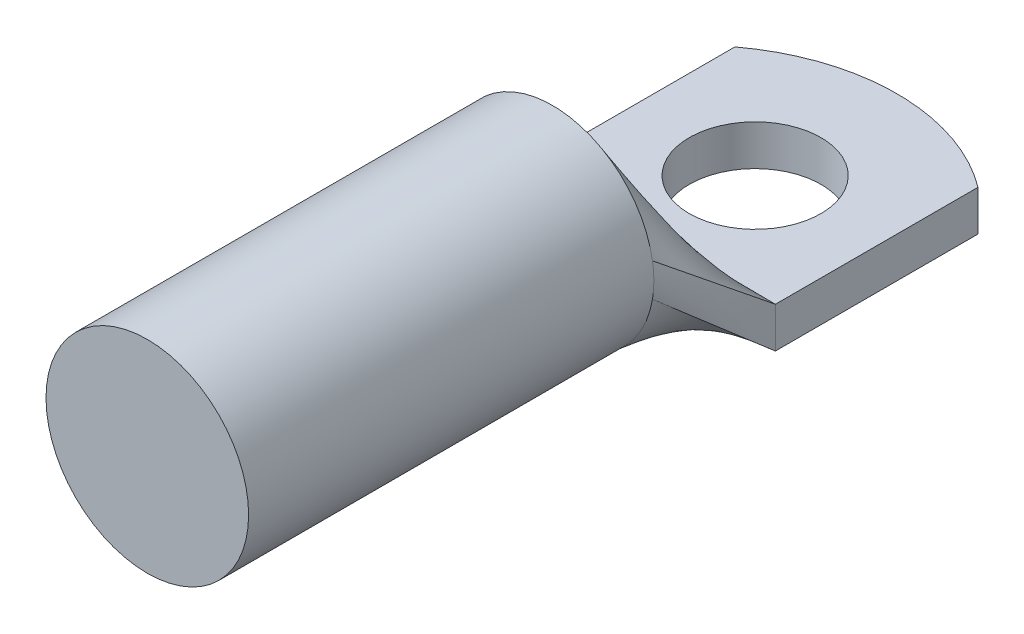
ISO-10303-21;
HEADER;
FILE_DESCRIPTION(('STEP AP214'),'2;1');
FILE_NAME('part.step','',(''),(''),'','','');
FILE_SCHEMA(('AUTOMOTIVE_DESIGN { 1 0 10303 214 1 1 1 1 }'));
ENDSEC;
DATA;
#1=APPLICATION_CONTEXT('core data for automotive mechanical design processes');
#2=APPLICATION_PROTOCOL_DEFINITION('international standard','automotive_design',2000,#1);
#3=PRODUCT_CONTEXT('',#1,'mechanical');
#4=PRODUCT('Part','Part','',(#3));
#5=PRODUCT_RELATED_PRODUCT_CATEGORY('part','',(#4));
#6=PRODUCT_DEFINITION_FORMATION('','',#4);
#7=PRODUCT_DEFINITION_CONTEXT('part definition',#1,'design');
#8=PRODUCT_DEFINITION('design','',#6,#7);
#9=PRODUCT_DEFINITION_SHAPE('','',#8);
#10=(LENGTH_UNIT() NAMED_UNIT(*) SI_UNIT(.MILLI.,.METRE.));
#11=(NAMED_UNIT(*) PLANE_ANGLE_UNIT() SI_UNIT($,.RADIAN.));
#12=(NAMED_UNIT(*) SI_UNIT($,.STERADIAN.) SOLID_ANGLE_UNIT());
#13=UNCERTAINTY_MEASURE_WITH_UNIT(LENGTH_MEASURE(1.E-05),#10,'distance_accuracy_value','');
#14=(GEOMETRIC_REPRESENTATION_CONTEXT(3) GLOBAL_UNCERTAINTY_ASSIGNED_CONTEXT((#13)) GLOBAL_UNIT_ASSIGNED_CONTEXT((#10,
#11,#12)) REPRESENTATION_CONTEXT('',''));
#15=CARTESIAN_POINT('',(0.,0.,0.));
#16=DIRECTION('',(0.,0.,1.));
#17=DIRECTION('',(1.,0.,0.));
#18=AXIS2_PLACEMENT_3D('',#15,#16,#17);
#19=CARTESIAN_POINT('',(0.,2.,3.));
#20=DIRECTION('',(0.,-1.,0.));
#21=DIRECTION('',(0.,0.,-1.));
#22=AXIS2_PLACEMENT_3D('',#19,#20,#21);
#23=PLANE('',#22);
#24=CARTESIAN_POINT('',(0.,2.,3.));
#25=DIRECTION('',(0.,1.,0.));
#26=DIRECTION('',(0.,0.,-1.));
#27=AXIS2_PLACEMENT_3D('',#24,#25,#26);
#28=CIRCLE('',#27,10.);
#29=CARTESIAN_POINT('',(6.,2.,-5.));
#30=VERTEX_POINT('',#29);
#31=CARTESIAN_POINT('',(-6.,2.,-5.));
#32=VERTEX_POINT('',#31);
#33=EDGE_CURVE('E207',#30,#32,#28,.T.);
#34=ORIENTED_EDGE('',*,*,#33,.T.);
#35=DIRECTION('',(0.,0.,1.));
#36=VECTOR('',#35,1.);
#37=CARTESIAN_POINT('',(-6.,2.,-5.));
#38=LINE('',#37,#36);
#39=CARTESIAN_POINT('',(-6.,2.,5.));
#40=VERTEX_POINT('',#39);
#41=EDGE_CURVE('E112',#32,#40,#38,.T.);
#42=ORIENTED_EDGE('',*,*,#41,.T.);
#43=CARTESIAN_POINT('',(6.,2.,5.));
#44=CARTESIAN_POINT('',(5.5,2.,5.));
#45=CARTESIAN_POINT('',(5.,2.,5.));
#46=CARTESIAN_POINT('',(4.,2.,5.));
#47=CARTESIAN_POINT('',(3.5,2.,5.));
#48=CARTESIAN_POINT('',(2.50000000000001,2.,5.));
#49=CARTESIAN_POINT('',(2.00000000000001,2.,5.));
#50=CARTESIAN_POINT('',(1.25000000000001,2.,5.));
#51=CARTESIAN_POINT('',(1.00000000000001,2.,5.));
#52=CARTESIAN_POINT('',(0.500000000000006,2.,5.));
#53=CARTESIAN_POINT('',(0.250000000000005,2.,5.));
#54=CARTESIAN_POINT('',(-0.249999999999995,2.,5.));
#55=CARTESIAN_POINT('',(-0.499999999999996,2.,5.));
#56=CARTESIAN_POINT('',(-0.999999999999996,2.,5.));
#57=CARTESIAN_POINT('',(-1.25,2.,5.));
#58=CARTESIAN_POINT('',(-2.,2.,5.));
#59=CARTESIAN_POINT('',(-2.5,2.,5.));
#60=CARTESIAN_POINT('',(-3.5,2.,5.));
#61=CARTESIAN_POINT('',(-4.,2.,5.));
#62=CARTESIAN_POINT('',(-5.,2.,5.));
#63=CARTESIAN_POINT('',(-5.5,2.,5.));
#64=CARTESIAN_POINT('',(-6.,2.,5.));
#65=B_SPLINE_CURVE_WITH_KNOTS('',3,(#43,#44,#45,#46,#47,#48,#49,#50,#51,#52,#53,#54,#55,#56,#57,
#58,#59,#60,#61,#62,#63,#64),.UNSPECIFIED.,.F.,.F.,(4,2,2,2,2,2,2,2,2,2,4),(0.,0.125,0.25,0.375,
0.4375,0.5,0.5625,0.625,0.75,0.875,1.),.UNSPECIFIED.);
#66=CARTESIAN_POINT('',(6.,2.,5.));
#67=VERTEX_POINT('',#66);
#68=EDGE_CURVE('E212',#40,#67,#65,.F.);
#69=ORIENTED_EDGE('',*,*,#68,.T.);
#70=DIRECTION('',(0.,0.,-1.));
#71=VECTOR('',#70,1.);
#72=CARTESIAN_POINT('',(6.,2.,-5.));
#73=LINE('',#72,#71);
#74=EDGE_CURVE('E87',#67,#30,#73,.T.);
#75=ORIENTED_EDGE('',*,*,#74,.T.);
#76=EDGE_LOOP('',(#34,#42,#69,#75));
#77=FACE_BOUND('',#76,.T.);
#78=CARTESIAN_POINT('',(0.,2.,0.));
#79=DIRECTION('',(0.,1.,0.));
#80=DIRECTION('',(0.,0.,1.));
#81=AXIS2_PLACEMENT_3D('',#78,#79,#80);
#82=CIRCLE('',#81,3.25);
#83=CARTESIAN_POINT('',(0.,2.,3.25));
#84=VERTEX_POINT('',#83);
#85=EDGE_CURVE('E191',#84,#84,#82,.T.);
#86=ORIENTED_EDGE('',*,*,#85,.F.);
#87=EDGE_LOOP('',(#86));
#88=FACE_BOUND('',#87,.T.);
#89=ADVANCED_FACE('F66',(#77,#88),#23,.F.);
#90=CARTESIAN_POINT('',(0.,0.,3.));
#91=DIRECTION('',(0.,-1.,0.));
#92=DIRECTION('',(0.,0.,-1.));
#93=AXIS2_PLACEMENT_3D('',#90,#91,#92);
#94=PLANE('',#93);
#95=CARTESIAN_POINT('',(0.,0.,3.));
#96=DIRECTION('',(0.,1.,0.));
#97=DIRECTION('',(0.,0.,-1.));
#98=AXIS2_PLACEMENT_3D('',#95,#96,#97);
#99=CIRCLE('',#98,10.);
#100=CARTESIAN_POINT('',(6.,0.,-5.));
#101=VERTEX_POINT('',#100);
#102=CARTESIAN_POINT('',(-6.,0.,-5.));
#103=VERTEX_POINT('',#102);
#104=EDGE_CURVE('E195',#101,#103,#99,.T.);
#105=ORIENTED_EDGE('',*,*,#104,.F.);
#106=DIRECTION('',(0.,0.,-1.));
#107=VECTOR('',#106,1.);
#108=CARTESIAN_POINT('',(6.,0.,-5.));
#109=LINE('',#108,#107);
#110=CARTESIAN_POINT('',(6.,0.,5.));
#111=VERTEX_POINT('',#110);
#112=EDGE_CURVE('E105',#111,#101,#109,.T.);
#113=ORIENTED_EDGE('',*,*,#112,.F.);
#114=CARTESIAN_POINT('',(-6.,0.,5.));
#115=CARTESIAN_POINT('',(-5.5,0.,5.));
#116=CARTESIAN_POINT('',(-5.,0.,5.));
#117=CARTESIAN_POINT('',(-4.00000000000001,0.,5.));
#118=CARTESIAN_POINT('',(-3.50000000000001,0.,5.));
#119=CARTESIAN_POINT('',(-2.50000000000001,0.,5.));
#120=CARTESIAN_POINT('',(-2.00000000000001,0.,5.));
#121=CARTESIAN_POINT('',(-1.25000000000001,0.,5.));
#122=CARTESIAN_POINT('',(-1.00000000000001,0.,5.));
#123=CARTESIAN_POINT('',(-0.500000000000009,0.,5.));
#124=CARTESIAN_POINT('',(-0.250000000000009,0.,5.));
#125=CARTESIAN_POINT('',(0.249999999999992,0.,5.));
#126=CARTESIAN_POINT('',(0.499999999999992,0.,5.));
#127=CARTESIAN_POINT('',(0.999999999999993,0.,5.));
#128=CARTESIAN_POINT('',(1.24999999999999,0.,5.));
#129=CARTESIAN_POINT('',(1.99999999999999,0.,5.));
#130=CARTESIAN_POINT('',(2.49999999999999,0.,5.));
#131=CARTESIAN_POINT('',(3.5,0.,5.));
#132=CARTESIAN_POINT('',(4.,0.,5.));
#133=CARTESIAN_POINT('',(5.,0.,5.));
#134=CARTESIAN_POINT('',(5.5,0.,5.));
#135=CARTESIAN_POINT('',(6.,0.,5.));
#136=B_SPLINE_CURVE_WITH_KNOTS('',3,(#114,#115,#116,#117,#118,#119,#120,#121,#122,#123,#124,
#125,#126,#127,#128,#129,#130,#131,#132,#133,#134,#135),.UNSPECIFIED.,.F.,.F.,(4,2,2,2,2,2,2,2,
2,2,4),(0.,0.125,0.25,0.375,0.4375,0.5,0.5625,0.625,0.75,0.875,1.),.UNSPECIFIED.);
#137=CARTESIAN_POINT('',(-6.,0.,5.));
#138=VERTEX_POINT('',#137);
#139=EDGE_CURVE('E203',#138,#111,#136,.T.);
#140=ORIENTED_EDGE('',*,*,#139,.F.);
#141=DIRECTION('',(0.,0.,1.));
#142=VECTOR('',#141,1.);
#143=CARTESIAN_POINT('',(-6.,0.,-5.));
#144=LINE('',#143,#142);
#145=EDGE_CURVE('E199',#103,#138,#144,.T.);
#146=ORIENTED_EDGE('',*,*,#145,.F.);
#147=EDGE_LOOP('',(#105,#113,#140,#146));
#148=FACE_BOUND('',#147,.T.);
#149=CARTESIAN_POINT('',(0.,0.,0.));
#150=DIRECTION('',(0.,1.,0.));
#151=DIRECTION('',(0.,0.,1.));
#152=AXIS2_PLACEMENT_3D('',#149,#150,#151);
#153=CIRCLE('',#152,3.25);
#154=CARTESIAN_POINT('',(0.,0.,3.25));
#155=VERTEX_POINT('',#154);
#156=EDGE_CURVE('E187',#155,#155,#153,.T.);
#157=ORIENTED_EDGE('',*,*,#156,.T.);
#158=EDGE_LOOP('',(#157));
#159=FACE_BOUND('',#158,.T.);
#160=ADVANCED_FACE('F246',(#148,#159),#94,.T.);
#161=CARTESIAN_POINT('',(0.,2.,3.));
#162=DIRECTION('',(0.,-1.,0.));
#163=DIRECTION('',(0.,0.,-1.));
#164=AXIS2_PLACEMENT_3D('',#161,#162,#163);
#165=CYLINDRICAL_SURFACE('',#164,10.);
#166=ORIENTED_EDGE('',*,*,#104,.T.);
#167=DIRECTION('',(0.,-1.,0.));
#168=VECTOR('',#167,1.);
#169=CARTESIAN_POINT('',(-6.,2.,-5.));
#170=LINE('',#169,#168);
#171=EDGE_CURVE('E12',#32,#103,#170,.T.);
#172=ORIENTED_EDGE('',*,*,#171,.F.);
#173=ORIENTED_EDGE('',*,*,#33,.F.);
#174=DIRECTION('',(0.,-1.,0.));
#175=VECTOR('',#174,1.);
#176=CARTESIAN_POINT('',(6.,2.,-5.));
#177=LINE('',#176,#175);
#178=EDGE_CURVE('E216',#30,#101,#177,.T.);
#179=ORIENTED_EDGE('',*,*,#178,.T.);
#180=EDGE_LOOP('',(#166,#172,#173,#179));
#181=FACE_BOUND('',#180,.T.);
#182=ADVANCED_FACE('F68',(#181),#165,.T.);
#183=CARTESIAN_POINT('',(-6.,2.,-5.));
#184=DIRECTION('',(1.,0.,0.));
#185=DIRECTION('',(0.,0.,-1.));
#186=AXIS2_PLACEMENT_3D('',#183,#184,#185);
#187=PLANE('',#186);
#188=ORIENTED_EDGE('',*,*,#145,.T.);
#189=CARTESIAN_POINT('',(-6.,2.,5.));
#190=CARTESIAN_POINT('',(-6.,1.66666666666667,5.));
#191=CARTESIAN_POINT('',(-6.,1.33333333333334,5.));
#192=CARTESIAN_POINT('',(-6.,0.666666666666669,5.));
#193=CARTESIAN_POINT('',(-6.,0.333333333333335,5.));
#194=CARTESIAN_POINT('',(-6.,0.,5.));
#195=B_SPLINE_CURVE_WITH_KNOTS('',3,(#189,#190,#191,#192,#193,#194),.UNSPECIFIED.,.F.,.F.,(4,2,
4),(0.,0.5,1.),.UNSPECIFIED.);
#196=EDGE_CURVE('E78',#40,#138,#195,.T.);
#197=ORIENTED_EDGE('',*,*,#196,.F.);
#198=ORIENTED_EDGE('',*,*,#41,.F.);
#199=ORIENTED_EDGE('',*,*,#171,.T.);
#200=EDGE_LOOP('',(#188,#197,#198,#199));
#201=FACE_BOUND('',#200,.T.);
#202=ADVANCED_FACE('F232',(#201),#187,.F.);
#203=CARTESIAN_POINT('',(6.,2.,-5.));
#204=DIRECTION('',(-1.,0.,0.));
#205=DIRECTION('',(0.,0.,1.));
#206=AXIS2_PLACEMENT_3D('',#203,#204,#205);
#207=PLANE('',#206);
#208=ORIENTED_EDGE('',*,*,#112,.T.);
#209=ORIENTED_EDGE('',*,*,#178,.F.);
#210=ORIENTED_EDGE('',*,*,#74,.F.);
#211=CARTESIAN_POINT('',(6.,0.,5.));
#212=CARTESIAN_POINT('',(6.,0.333333333333331,5.));
#213=CARTESIAN_POINT('',(6.,0.666666666666663,5.));
#214=CARTESIAN_POINT('',(6.,1.33333333333333,5.));
#215=CARTESIAN_POINT('',(6.,1.66666666666666,5.));
#216=CARTESIAN_POINT('',(6.,2.,5.));
#217=B_SPLINE_CURVE_WITH_KNOTS('',3,(#211,#212,#213,#214,#215,#216),.UNSPECIFIED.,.F.,.F.,(4,2,
4),(0.,0.5,1.),.UNSPECIFIED.);
#218=EDGE_CURVE('E101',#67,#111,#217,.F.);
#219=ORIENTED_EDGE('',*,*,#218,.T.);
#220=EDGE_LOOP('',(#208,#209,#210,#219));
#221=FACE_BOUND('',#220,.T.);
#222=ADVANCED_FACE('F241',(#221),#207,.F.);
#223=CARTESIAN_POINT('',(0.,2.,0.));
#224=DIRECTION('',(0.,-1.,0.));
#225=DIRECTION('',(0.,0.,-1.));
#226=AXIS2_PLACEMENT_3D('',#223,#224,#225);
#227=CYLINDRICAL_SURFACE('',#226,3.25);
#228=ORIENTED_EDGE('',*,*,#85,.T.);
#229=EDGE_LOOP('',(#228));
#230=FACE_BOUND('',#229,.T.);
#231=ORIENTED_EDGE('',*,*,#156,.F.);
#232=EDGE_LOOP('',(#231));
#233=FACE_BOUND('',#232,.T.);
#234=ADVANCED_FACE('F245',(#230,#233),#227,.F.);
#235=CARTESIAN_POINT('',(4.93196961916072,5.82199493652679,10.));
#236=CARTESIAN_POINT('',(6.,2.,5.));
#237=CARTESIAN_POINT('',(4.97701466420576,5.55172466625652,10.));
#238=CARTESIAN_POINT('',(6.,1.66666666666666,5.));
#239=CARTESIAN_POINT('',(4.99953718672828,5.27586233312826,10.));
#240=CARTESIAN_POINT('',(6.,1.33333333333333,5.));
#241=CARTESIAN_POINT('',(4.99953718672828,4.72413766687174,10.));
#242=CARTESIAN_POINT('',(6.,0.666666666666663,5.));
#243=CARTESIAN_POINT('',(4.97701466420576,4.44827533374348,10.));
#244=CARTESIAN_POINT('',(6.,0.333333333333331,5.));
#245=CARTESIAN_POINT('',(4.93196961916072,4.17800506347321,10.));
#246=CARTESIAN_POINT('',(6.,0.,5.));
#247=B_SPLINE_SURFACE_WITH_KNOTS('',3,1,((#235,#236),(#237,#238),(#239,#240),(#241,#242),(#243,
#244),(#245,#246)),.UNSPECIFIED.,.F.,.F.,.F.,(4,2,4),(2,2),(0.,0.5,1.),(0.,1.),.UNSPECIFIED.);
#248=CARTESIAN_POINT('',(0.,5.,10.));
#249=DIRECTION('',(0.,0.,1.));
#250=DIRECTION('',(1.,0.,0.));
#251=AXIS2_PLACEMENT_3D('',#248,#249,#250);
#252=CIRCLE('',#251,5.);
#253=CARTESIAN_POINT('',(4.9323950518684,4.17793464109968,10.));
#254=VERTEX_POINT('',#253);
#255=CARTESIAN_POINT('',(4.93242576113821,5.8220703510954,10.));
#256=VERTEX_POINT('',#255);
#257=EDGE_CURVE('E70',#254,#256,#252,.T.);
#258=DIRECTION('',(0.161755187205517,-0.632766635960895,-0.757259297616636));
#259=VECTOR('',#258,1.);
#260=CARTESIAN_POINT('',(5.46598480958036,2.08900253173661,7.5));
#261=LINE('',#260,#259);
#262=EDGE_CURVE('E139',#254,#111,#261,.T.);
#263=DIRECTION('',(-0.16731261114305,0.598735732688897,0.783276459849257));
#264=VECTOR('',#263,1.);
#265=CARTESIAN_POINT('',(5.46598480958036,3.91099746826339,7.5));
#266=LINE('',#265,#264);
#267=EDGE_CURVE('E145',#67,#256,#266,.T.);
#268=ORIENTED_EDGE('',*,*,#257,.F.);
#269=ORIENTED_EDGE('',*,*,#262,.T.);
#270=ORIENTED_EDGE('',*,*,#218,.F.);
#271=ORIENTED_EDGE('',*,*,#267,.T.);
#272=EDGE_LOOP('',(#268,#269,#270,#271));
#273=FACE_BOUND('',#272,.T.);
#274=ADVANCED_FACE('F299',(#273),#247,.T.);
#275=CARTESIAN_POINT('',(4.93196961916072,4.17800506347321,10.));
#276=CARTESIAN_POINT('',(6.,0.,5.));
#277=CARTESIAN_POINT('',(4.86440205159315,3.77259965806781,10.));
#278=CARTESIAN_POINT('',(5.5,0.,5.));
#279=CARTESIAN_POINT('',(4.74000037642108,3.3310688458779,10.));
#280=CARTESIAN_POINT('',(5.,0.,5.));
#281=CARTESIAN_POINT('',(4.3126712777103,2.42050368946108,10.));
#282=CARTESIAN_POINT('',(4.,0.,5.));
#283=CARTESIAN_POINT('',(4.00778495268363,1.95107761739795,10.));
#284=CARTESIAN_POINT('',(3.5,0.,5.));
#285=CARTESIAN_POINT('',(3.17487338395159,1.09123460438402,10.));
#286=CARTESIAN_POINT('',(2.49999999999999,0.,5.));
#287=CARTESIAN_POINT('',(2.64453878324341,0.703152486986672,10.));
#288=CARTESIAN_POINT('',(1.99999999999999,0.,5.));
#289=CARTESIAN_POINT('',(1.71809234752857,0.292316953436055,10.));
#290=CARTESIAN_POINT('',(1.24999999999999,0.,5.));
#291=CARTESIAN_POINT('',(1.38848176241261,0.18398938149596,10.));
#292=CARTESIAN_POINT('',(0.999999999999993,0.,5.));
#293=CARTESIAN_POINT('',(0.705852440970315,0.0377815229806404,10.));
#294=CARTESIAN_POINT('',(0.499999999999992,0.,5.));
#295=CARTESIAN_POINT('',(0.352969620159596,0.,10.));
#296=CARTESIAN_POINT('',(0.249999999999992,0.,5.));
#297=CARTESIAN_POINT('',(-0.352969620159601,0.,10.));
#298=CARTESIAN_POINT('',(-0.250000000000009,0.,5.));
#299=CARTESIAN_POINT('',(-0.705852440970319,0.0377815229806409,10.));
#300=CARTESIAN_POINT('',(-0.500000000000009,0.,5.));
#301=CARTESIAN_POINT('',(-1.38848176241261,0.183989381495961,10.));
#302=CARTESIAN_POINT('',(-1.00000000000001,0.,5.));
#303=CARTESIAN_POINT('',(-1.71809234752857,0.292316953436056,10.));
#304=CARTESIAN_POINT('',(-1.25000000000001,0.,5.));
#305=CARTESIAN_POINT('',(-2.64453878324341,0.703152486986675,10.));
#306=CARTESIAN_POINT('',(-2.00000000000001,0.,5.));
#307=CARTESIAN_POINT('',(-3.17487338395159,1.09123460438403,10.));
#308=CARTESIAN_POINT('',(-2.50000000000001,0.,5.));
#309=CARTESIAN_POINT('',(-4.00778495268363,1.95107761739795,10.));
#310=CARTESIAN_POINT('',(-3.50000000000001,0.,5.));
#311=CARTESIAN_POINT('',(-4.31267127771031,2.42050368946108,10.));
#312=CARTESIAN_POINT('',(-4.00000000000001,0.,5.));
#313=CARTESIAN_POINT('',(-4.74000037642108,3.3310688458779,9.99999999999999));
#314=CARTESIAN_POINT('',(-5.,0.,5.));
#315=CARTESIAN_POINT('',(-4.86440205159315,3.77259965806781,10.));
#316=CARTESIAN_POINT('',(-5.5,0.,5.));
#317=CARTESIAN_POINT('',(-4.93196961916072,4.17800506347322,10.));
#318=CARTESIAN_POINT('',(-6.,0.,5.));
#319=B_SPLINE_SURFACE_WITH_KNOTS('',3,1,((#275,#276),(#277,#278),(#279,#280),(#281,#282),(#283,
#284),(#285,#286),(#287,#288),(#289,#290),(#291,#292),(#293,#294),(#295,#296),(#297,#298),(#299,
#300),(#301,#302),(#303,#304),(#305,#306),(#307,#308),(#309,#310),(#311,#312),(#313,#314),(#315,
#316),(#317,#318)),.UNSPECIFIED.,.F.,.F.,.F.,(4,2,2,2,2,2,2,2,2,2,4),(2,2),(0.,0.125,0.25,0.375,
0.4375,0.5,0.5625,0.625,0.75,0.875,1.),(0.,1.),.UNSPECIFIED.);
#320=CARTESIAN_POINT('',(-4.93240454729888,4.17793317693698,10.));
#321=VERTEX_POINT('',#320);
#322=EDGE_CURVE('E131',#321,#254,#252,.T.);
#323=DIRECTION('',(-0.161755187205517,-0.632766635960895,-0.757259297616636));
#324=VECTOR('',#323,1.);
#325=CARTESIAN_POINT('',(-5.46598480958036,2.08900253173661,7.5));
#326=LINE('',#325,#324);
#327=EDGE_CURVE('E136',#321,#138,#326,.T.);
#328=ORIENTED_EDGE('',*,*,#322,.F.);
#329=ORIENTED_EDGE('',*,*,#327,.T.);
#330=ORIENTED_EDGE('',*,*,#139,.T.);
#331=ORIENTED_EDGE('',*,*,#262,.F.);
#332=EDGE_LOOP('',(#328,#329,#330,#331));
#333=FACE_BOUND('',#332,.T.);
#334=ADVANCED_FACE('F134',(#333),#319,.T.);
#335=CARTESIAN_POINT('',(-4.93196961916072,5.82199493652679,10.));
#336=CARTESIAN_POINT('',(-6.,2.,5.));
#337=CARTESIAN_POINT('',(-4.86440205159315,6.22740034193219,10.));
#338=CARTESIAN_POINT('',(-5.5,2.,5.));
#339=CARTESIAN_POINT('',(-4.74000037642108,6.6689311541221,10.));
#340=CARTESIAN_POINT('',(-5.,2.,5.));
#341=CARTESIAN_POINT('',(-4.3126712777103,7.57949631053892,10.));
#342=CARTESIAN_POINT('',(-4.,2.,5.));
#343=CARTESIAN_POINT('',(-4.00778495268363,8.04892238260205,10.));
#344=CARTESIAN_POINT('',(-3.5,2.,5.));
#345=CARTESIAN_POINT('',(-3.17487338395159,8.90876539561598,10.));
#346=CARTESIAN_POINT('',(-2.5,2.,5.));
#347=CARTESIAN_POINT('',(-2.64453878324341,9.29684751301333,10.));
#348=CARTESIAN_POINT('',(-2.,2.,5.));
#349=CARTESIAN_POINT('',(-1.71809234752857,9.70768304656394,10.));
#350=CARTESIAN_POINT('',(-1.25,2.,5.));
#351=CARTESIAN_POINT('',(-1.38848176241261,9.81601061850404,10.));
#352=CARTESIAN_POINT('',(-0.999999999999996,2.,5.));
#353=CARTESIAN_POINT('',(-0.705852440970317,9.96221847701936,10.));
#354=CARTESIAN_POINT('',(-0.499999999999996,2.,5.));
#355=CARTESIAN_POINT('',(-0.352969620159599,10.,10.));
#356=CARTESIAN_POINT('',(-0.249999999999995,2.,5.));
#357=CARTESIAN_POINT('',(0.352969620159598,10.,10.));
#358=CARTESIAN_POINT('',(0.250000000000005,2.,5.));
#359=CARTESIAN_POINT('',(0.705852440970317,9.96221847701936,10.));
#360=CARTESIAN_POINT('',(0.500000000000006,2.,5.));
#361=CARTESIAN_POINT('',(1.38848176241261,9.81601061850404,10.));
#362=CARTESIAN_POINT('',(1.00000000000001,2.,5.));
#363=CARTESIAN_POINT('',(1.71809234752857,9.70768304656395,10.));
#364=CARTESIAN_POINT('',(1.25000000000001,2.,5.));
#365=CARTESIAN_POINT('',(2.64453878324341,9.29684751301333,10.));
#366=CARTESIAN_POINT('',(2.00000000000001,2.,5.));
#367=CARTESIAN_POINT('',(3.17487338395159,8.90876539561598,10.));
#368=CARTESIAN_POINT('',(2.50000000000001,2.,5.));
#369=CARTESIAN_POINT('',(4.00778495268363,8.04892238260205,10.));
#370=CARTESIAN_POINT('',(3.5,2.,5.));
#371=CARTESIAN_POINT('',(4.3126712777103,7.57949631053892,10.));
#372=CARTESIAN_POINT('',(4.,2.,5.));
#373=CARTESIAN_POINT('',(4.74000037642108,6.6689311541221,9.99999999999999));
#374=CARTESIAN_POINT('',(5.,2.,5.));
#375=CARTESIAN_POINT('',(4.86440205159315,6.22740034193219,10.));
#376=CARTESIAN_POINT('',(5.5,2.,5.));
#377=CARTESIAN_POINT('',(4.93196961916072,5.82199493652679,10.));
#378=CARTESIAN_POINT('',(6.,2.,5.));
#379=B_SPLINE_SURFACE_WITH_KNOTS('',3,1,((#335,#336),(#337,#338),(#339,#340),(#341,#342),(#343,
#344),(#345,#346),(#347,#348),(#349,#350),(#351,#352),(#353,#354),(#355,#356),(#357,#358),(#359,
#360),(#361,#362),(#363,#364),(#365,#366),(#367,#368),(#369,#370),(#371,#372),(#373,#374),(#375,
#376),(#377,#378)),.UNSPECIFIED.,.F.,.F.,.F.,(4,2,2,2,2,2,2,2,2,2,4),(2,2),(0.,0.125,0.25,0.375,
0.4375,0.5,0.5625,0.625,0.75,0.875,1.),(0.,1.),.UNSPECIFIED.);
#380=CARTESIAN_POINT('',(-4.93241621388985,5.8220688832201,10.));
#381=VERTEX_POINT('',#380);
#382=EDGE_CURVE('E161',#256,#381,#252,.T.);
#383=DIRECTION('',(-0.16731261114305,-0.598735732688897,-0.783276459849257));
#384=VECTOR('',#383,1.);
#385=CARTESIAN_POINT('',(-5.46598480958036,3.91099746826339,7.5));
#386=LINE('',#385,#384);
#387=EDGE_CURVE('E156',#381,#40,#386,.T.);
#388=ORIENTED_EDGE('',*,*,#382,.F.);
#389=ORIENTED_EDGE('',*,*,#267,.F.);
#390=ORIENTED_EDGE('',*,*,#68,.F.);
#391=ORIENTED_EDGE('',*,*,#387,.F.);
#392=EDGE_LOOP('',(#388,#389,#390,#391));
#393=FACE_BOUND('',#392,.T.);
#394=ADVANCED_FACE('F302',(#393),#379,.T.);
#395=CARTESIAN_POINT('',(-4.93196961916072,4.17800506347322,10.));
#396=CARTESIAN_POINT('',(-6.,0.,5.));
#397=CARTESIAN_POINT('',(-4.97701466420576,4.44827533374349,10.));
#398=CARTESIAN_POINT('',(-6.,0.333333333333335,5.));
#399=CARTESIAN_POINT('',(-4.99953718672828,4.72413766687174,10.));
#400=CARTESIAN_POINT('',(-6.,0.666666666666669,5.));
#401=CARTESIAN_POINT('',(-4.99953718672828,5.27586233312826,10.));
#402=CARTESIAN_POINT('',(-6.,1.33333333333334,5.));
#403=CARTESIAN_POINT('',(-4.97701466420576,5.55172466625652,10.));
#404=CARTESIAN_POINT('',(-6.,1.66666666666667,5.));
#405=CARTESIAN_POINT('',(-4.93196961916072,5.82199493652679,10.));
#406=CARTESIAN_POINT('',(-6.,2.,5.));
#407=B_SPLINE_SURFACE_WITH_KNOTS('',3,1,((#395,#396),(#397,#398),(#399,#400),(#401,#402),(#403,
#404),(#405,#406)),.UNSPECIFIED.,.F.,.F.,.F.,(4,2,4),(2,2),(0.,0.5,1.),(0.,1.),.UNSPECIFIED.);
#408=EDGE_CURVE('E151',#381,#321,#252,.T.);
#409=ORIENTED_EDGE('',*,*,#408,.F.);
#410=ORIENTED_EDGE('',*,*,#387,.T.);
#411=ORIENTED_EDGE('',*,*,#196,.T.);
#412=ORIENTED_EDGE('',*,*,#327,.F.);
#413=EDGE_LOOP('',(#409,#410,#411,#412));
#414=FACE_BOUND('',#413,.T.);
#415=ADVANCED_FACE('F149',(#414),#407,.T.);
#416=CARTESIAN_POINT('',(0.,5.,30.));
#417=DIRECTION('',(0.,0.,-1.));
#418=DIRECTION('',(-1.,0.,0.));
#419=AXIS2_PLACEMENT_3D('',#416,#417,#418);
#420=PLANE('',#419);
#421=CARTESIAN_POINT('',(0.,5.,30.));
#422=DIRECTION('',(0.,0.,1.));
#423=DIRECTION('',(1.,0.,0.));
#424=AXIS2_PLACEMENT_3D('',#421,#422,#423);
#425=CIRCLE('',#424,5.);
#426=CARTESIAN_POINT('',(5.,5.,30.));
#427=VERTEX_POINT('',#426);
#428=EDGE_CURVE('E164',#427,#427,#425,.T.);
#429=ORIENTED_EDGE('',*,*,#428,.T.);
#430=EDGE_LOOP('',(#429));
#431=FACE_BOUND('',#430,.T.);
#432=ADVANCED_FACE('F367',(#431),#420,.F.);
#433=CARTESIAN_POINT('',(0.,5.,10.));
#434=DIRECTION('',(0.,0.,1.));
#435=DIRECTION('',(1.,0.,0.));
#436=AXIS2_PLACEMENT_3D('',#433,#434,#435);
#437=CYLINDRICAL_SURFACE('',#436,5.);
#438=ORIENTED_EDGE('',*,*,#428,.F.);
#439=EDGE_LOOP('',(#438));
#440=FACE_BOUND('',#439,.T.);
#441=ORIENTED_EDGE('',*,*,#382,.T.);
#442=ORIENTED_EDGE('',*,*,#408,.T.);
#443=ORIENTED_EDGE('',*,*,#322,.T.);
#444=ORIENTED_EDGE('',*,*,#257,.T.);
#445=EDGE_LOOP('',(#441,#442,#443,#444));
#446=FACE_BOUND('',#445,.T.);
#447=ADVANCED_FACE('F160',(#440,#446),#437,.T.);
#448=CLOSED_SHELL('',(#89,#160,#182,#202,#222,#234,#274,#334,#394,#415,#432,#447));
#449=MANIFOLD_SOLID_BREP('B2',#448);
#450=ADVANCED_BREP_SHAPE_REPRESENTATION('',(#18,#449),#14);
#451=SHAPE_DEFINITION_REPRESENTATION(#9,#450);
ENDSEC;
END-ISO-10303-21;
